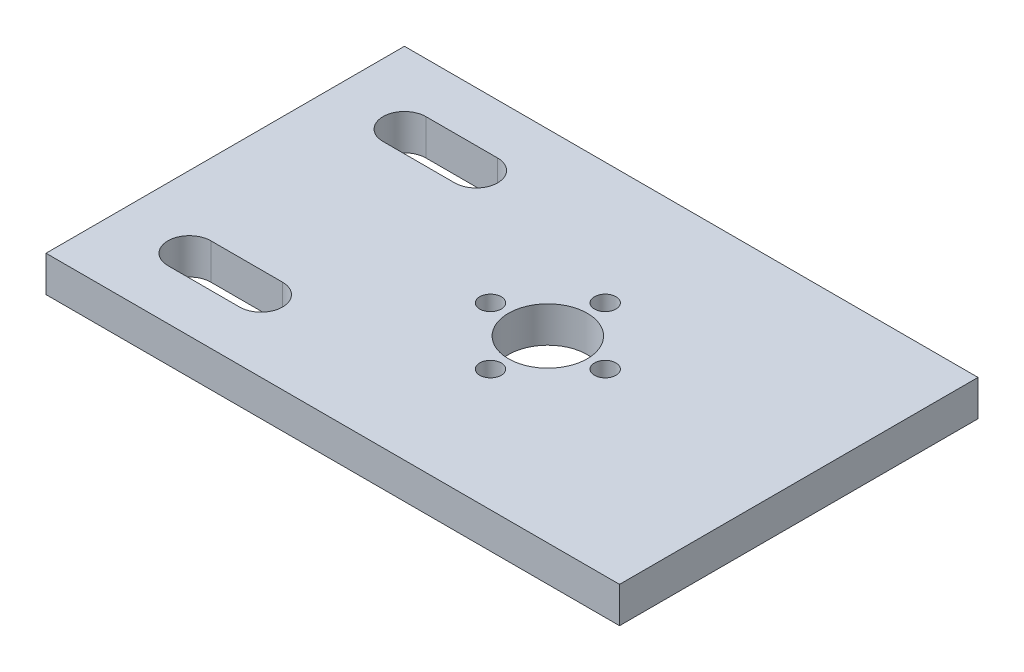
ISO-10303-21;
HEADER;
FILE_DESCRIPTION(('STEP AP214'),'2;1');
FILE_NAME('part.step','',(''),(''),'','','');
FILE_SCHEMA(('AUTOMOTIVE_DESIGN { 1 0 10303 214 1 1 1 1 }'));
ENDSEC;
DATA;
#1=APPLICATION_CONTEXT('core data for automotive mechanical design processes');
#2=APPLICATION_PROTOCOL_DEFINITION('international standard','automotive_design',2000,#1);
#3=PRODUCT_CONTEXT('',#1,'mechanical');
#4=PRODUCT('Part','Part','',(#3));
#5=PRODUCT_RELATED_PRODUCT_CATEGORY('part','',(#4));
#6=PRODUCT_DEFINITION_FORMATION('','',#4);
#7=PRODUCT_DEFINITION_CONTEXT('part definition',#1,'design');
#8=PRODUCT_DEFINITION('design','',#6,#7);
#9=PRODUCT_DEFINITION_SHAPE('','',#8);
#10=(LENGTH_UNIT() NAMED_UNIT(*) SI_UNIT(.MILLI.,.METRE.));
#11=(NAMED_UNIT(*) PLANE_ANGLE_UNIT() SI_UNIT($,.RADIAN.));
#12=(NAMED_UNIT(*) SI_UNIT($,.STERADIAN.) SOLID_ANGLE_UNIT());
#13=UNCERTAINTY_MEASURE_WITH_UNIT(LENGTH_MEASURE(1.E-05),#10,'distance_accuracy_value','');
#14=(GEOMETRIC_REPRESENTATION_CONTEXT(3) GLOBAL_UNCERTAINTY_ASSIGNED_CONTEXT((#13)) GLOBAL_UNIT_ASSIGNED_CONTEXT((#10,
#11,#12)) REPRESENTATION_CONTEXT('',''));
#15=CARTESIAN_POINT('',(0.,0.,0.));
#16=DIRECTION('',(0.,0.,1.));
#17=DIRECTION('',(1.,0.,0.));
#18=AXIS2_PLACEMENT_3D('',#15,#16,#17);
#19=CARTESIAN_POINT('',(0.,5.,0.));
#20=DIRECTION('',(0.,-1.,0.));
#21=DIRECTION('',(0.,0.,-1.));
#22=AXIS2_PLACEMENT_3D('',#19,#20,#21);
#23=PLANE('',#22);
#24=CARTESIAN_POINT('',(53.,5.,-25.));
#25=DIRECTION('',(0.,-1.,0.));
#26=DIRECTION('',(0.,0.,-1.));
#27=AXIS2_PLACEMENT_3D('',#24,#25,#26);
#28=CIRCLE('',#27,1.5);
#29=CARTESIAN_POINT('',(53.,5.,-26.5));
#30=VERTEX_POINT('',#29);
#31=EDGE_CURVE('E322',#30,#30,#28,.T.);
#32=ORIENTED_EDGE('',*,*,#31,.T.);
#33=EDGE_LOOP('',(#32));
#34=FACE_BOUND('',#33,.T.);
#35=CARTESIAN_POINT('',(45.,5.,-33.));
#36=DIRECTION('',(0.,-1.,0.));
#37=DIRECTION('',(0.,0.,-1.));
#38=AXIS2_PLACEMENT_3D('',#35,#36,#37);
#39=CIRCLE('',#38,1.5);
#40=CARTESIAN_POINT('',(45.,5.,-34.5));
#41=VERTEX_POINT('',#40);
#42=EDGE_CURVE('E326',#41,#41,#39,.T.);
#43=ORIENTED_EDGE('',*,*,#42,.T.);
#44=EDGE_LOOP('',(#43));
#45=FACE_BOUND('',#44,.T.);
#46=CARTESIAN_POINT('',(37.,5.,-25.));
#47=DIRECTION('',(0.,-1.,0.));
#48=DIRECTION('',(0.,0.,-1.));
#49=AXIS2_PLACEMENT_3D('',#46,#47,#48);
#50=CIRCLE('',#49,1.5);
#51=CARTESIAN_POINT('',(37.,5.,-26.5));
#52=VERTEX_POINT('',#51);
#53=EDGE_CURVE('E336',#52,#52,#50,.T.);
#54=ORIENTED_EDGE('',*,*,#53,.T.);
#55=EDGE_LOOP('',(#54));
#56=FACE_BOUND('',#55,.T.);
#57=CARTESIAN_POINT('',(45.,5.,-17.));
#58=DIRECTION('',(0.,-1.,0.));
#59=DIRECTION('',(0.,0.,-1.));
#60=AXIS2_PLACEMENT_3D('',#57,#58,#59);
#61=CIRCLE('',#60,1.5);
#62=CARTESIAN_POINT('',(45.,5.,-18.5));
#63=VERTEX_POINT('',#62);
#64=EDGE_CURVE('E342',#63,#63,#61,.T.);
#65=ORIENTED_EDGE('',*,*,#64,.T.);
#66=EDGE_LOOP('',(#65));
#67=FACE_BOUND('',#66,.T.);
#68=CARTESIAN_POINT('',(10.,5.,-40.));
#69=DIRECTION('',(0.,1.,0.));
#70=DIRECTION('',(0.,0.,1.));
#71=AXIS2_PLACEMENT_3D('',#68,#69,#70);
#72=CIRCLE('',#71,3.00000000000001);
#73=CARTESIAN_POINT('',(10.,5.,-43.));
#74=VERTEX_POINT('',#73);
#75=CARTESIAN_POINT('',(10.,5.,-37.));
#76=VERTEX_POINT('',#75);
#77=EDGE_CURVE('E161',#74,#76,#72,.T.);
#78=ORIENTED_EDGE('',*,*,#77,.F.);
#79=DIRECTION('',(-1.,0.,0.));
#80=VECTOR('',#79,1.);
#81=CARTESIAN_POINT('',(10.,5.,-43.));
#82=LINE('',#81,#80);
#83=CARTESIAN_POINT('',(20.,5.,-43.));
#84=VERTEX_POINT('',#83);
#85=EDGE_CURVE('E169',#84,#74,#82,.T.);
#86=ORIENTED_EDGE('',*,*,#85,.F.);
#87=CARTESIAN_POINT('',(20.,5.,-40.));
#88=DIRECTION('',(0.,1.,0.));
#89=DIRECTION('',(0.,0.,1.));
#90=AXIS2_PLACEMENT_3D('',#87,#88,#89);
#91=CIRCLE('',#90,3.00000000000001);
#92=CARTESIAN_POINT('',(20.,5.,-37.));
#93=VERTEX_POINT('',#92);
#94=EDGE_CURVE('E166',#93,#84,#91,.T.);
#95=ORIENTED_EDGE('',*,*,#94,.F.);
#96=DIRECTION('',(1.,0.,0.));
#97=VECTOR('',#96,1.);
#98=CARTESIAN_POINT('',(10.,5.,-37.));
#99=LINE('',#98,#97);
#100=EDGE_CURVE('E163',#76,#93,#99,.T.);
#101=ORIENTED_EDGE('',*,*,#100,.F.);
#102=EDGE_LOOP('',(#78,#86,#95,#101));
#103=FACE_BOUND('',#102,.T.);
#104=DIRECTION('',(0.,0.,1.));
#105=VECTOR('',#104,1.);
#106=CARTESIAN_POINT('',(0.,5.,0.));
#107=LINE('',#106,#105);
#108=CARTESIAN_POINT('',(0.,5.,-50.));
#109=VERTEX_POINT('',#108);
#110=CARTESIAN_POINT('',(0.,5.,0.));
#111=VERTEX_POINT('',#110);
#112=EDGE_CURVE('E192',#109,#111,#107,.T.);
#113=ORIENTED_EDGE('',*,*,#112,.T.);
#114=DIRECTION('',(1.,0.,0.));
#115=VECTOR('',#114,1.);
#116=CARTESIAN_POINT('',(0.,5.,0.));
#117=LINE('',#116,#115);
#118=CARTESIAN_POINT('',(80.,5.,0.));
#119=VERTEX_POINT('',#118);
#120=EDGE_CURVE('E195',#111,#119,#117,.T.);
#121=ORIENTED_EDGE('',*,*,#120,.T.);
#122=DIRECTION('',(0.,0.,-1.));
#123=VECTOR('',#122,1.);
#124=CARTESIAN_POINT('',(80.,5.,0.));
#125=LINE('',#124,#123);
#126=CARTESIAN_POINT('',(80.,5.,-50.));
#127=VERTEX_POINT('',#126);
#128=EDGE_CURVE('E198',#119,#127,#125,.T.);
#129=ORIENTED_EDGE('',*,*,#128,.T.);
#130=DIRECTION('',(-1.,0.,0.));
#131=VECTOR('',#130,1.);
#132=CARTESIAN_POINT('',(0.,5.,-50.));
#133=LINE('',#132,#131);
#134=EDGE_CURVE('E200',#127,#109,#133,.T.);
#135=ORIENTED_EDGE('',*,*,#134,.T.);
#136=EDGE_LOOP('',(#113,#121,#129,#135));
#137=FACE_BOUND('',#136,.T.);
#138=CARTESIAN_POINT('',(10.,5.,-10.));
#139=DIRECTION('',(0.,1.,0.));
#140=DIRECTION('',(0.,0.,1.));
#141=AXIS2_PLACEMENT_3D('',#138,#139,#140);
#142=CIRCLE('',#141,3.);
#143=CARTESIAN_POINT('',(10.,5.,-13.));
#144=VERTEX_POINT('',#143);
#145=CARTESIAN_POINT('',(10.,5.,-7.));
#146=VERTEX_POINT('',#145);
#147=EDGE_CURVE('E122',#144,#146,#142,.T.);
#148=ORIENTED_EDGE('',*,*,#147,.F.);
#149=DIRECTION('',(-1.,0.,0.));
#150=VECTOR('',#149,1.);
#151=CARTESIAN_POINT('',(10.,5.,-13.));
#152=LINE('',#151,#150);
#153=CARTESIAN_POINT('',(20.,5.,-13.));
#154=VERTEX_POINT('',#153);
#155=EDGE_CURVE('E145',#154,#144,#152,.T.);
#156=ORIENTED_EDGE('',*,*,#155,.F.);
#157=CARTESIAN_POINT('',(20.,5.,-10.));
#158=DIRECTION('',(0.,1.,0.));
#159=DIRECTION('',(0.,0.,1.));
#160=AXIS2_PLACEMENT_3D('',#157,#158,#159);
#161=CIRCLE('',#160,3.);
#162=CARTESIAN_POINT('',(20.,5.,-7.));
#163=VERTEX_POINT('',#162);
#164=EDGE_CURVE('E143',#163,#154,#161,.T.);
#165=ORIENTED_EDGE('',*,*,#164,.F.);
#166=DIRECTION('',(1.,0.,0.));
#167=VECTOR('',#166,1.);
#168=CARTESIAN_POINT('',(10.,5.,-7.));
#169=LINE('',#168,#167);
#170=EDGE_CURVE('E130',#146,#163,#169,.T.);
#171=ORIENTED_EDGE('',*,*,#170,.F.);
#172=EDGE_LOOP('',(#148,#156,#165,#171));
#173=FACE_BOUND('',#172,.T.);
#174=CARTESIAN_POINT('',(45.,5.,-25.));
#175=DIRECTION('',(0.,1.,0.));
#176=DIRECTION('',(0.,0.,1.));
#177=AXIS2_PLACEMENT_3D('',#174,#175,#176);
#178=CIRCLE('',#177,5.5);
#179=CARTESIAN_POINT('',(45.,5.,-19.5));
#180=VERTEX_POINT('',#179);
#181=EDGE_CURVE('E151',#180,#180,#178,.T.);
#182=ORIENTED_EDGE('',*,*,#181,.F.);
#183=EDGE_LOOP('',(#182));
#184=FACE_BOUND('',#183,.T.);
#185=ADVANCED_FACE('F33',(#34,#45,#56,#67,#103,#137,#173,#184),#23,.F.);
#186=CARTESIAN_POINT('',(0.,0.,0.));
#187=DIRECTION('',(0.,-1.,0.));
#188=DIRECTION('',(0.,0.,-1.));
#189=AXIS2_PLACEMENT_3D('',#186,#187,#188);
#190=PLANE('',#189);
#191=CARTESIAN_POINT('',(53.,0.,-25.));
#192=DIRECTION('',(0.,-1.,0.));
#193=DIRECTION('',(0.,0.,-1.));
#194=AXIS2_PLACEMENT_3D('',#191,#192,#193);
#195=CIRCLE('',#194,1.5);
#196=CARTESIAN_POINT('',(53.,0.,-26.5));
#197=VERTEX_POINT('',#196);
#198=EDGE_CURVE('E325',#197,#197,#195,.T.);
#199=ORIENTED_EDGE('',*,*,#198,.F.);
#200=EDGE_LOOP('',(#199));
#201=FACE_BOUND('',#200,.T.);
#202=CARTESIAN_POINT('',(45.,0.,-33.));
#203=DIRECTION('',(0.,-1.,0.));
#204=DIRECTION('',(0.,0.,-1.));
#205=AXIS2_PLACEMENT_3D('',#202,#203,#204);
#206=CIRCLE('',#205,1.5);
#207=CARTESIAN_POINT('',(45.,0.,-34.5));
#208=VERTEX_POINT('',#207);
#209=EDGE_CURVE('E331',#208,#208,#206,.T.);
#210=ORIENTED_EDGE('',*,*,#209,.F.);
#211=EDGE_LOOP('',(#210));
#212=FACE_BOUND('',#211,.T.);
#213=CARTESIAN_POINT('',(37.,0.,-25.));
#214=DIRECTION('',(0.,-1.,0.));
#215=DIRECTION('',(0.,0.,-1.));
#216=AXIS2_PLACEMENT_3D('',#213,#214,#215);
#217=CIRCLE('',#216,1.5);
#218=CARTESIAN_POINT('',(37.,0.,-26.5));
#219=VERTEX_POINT('',#218);
#220=EDGE_CURVE('E339',#219,#219,#217,.T.);
#221=ORIENTED_EDGE('',*,*,#220,.F.);
#222=EDGE_LOOP('',(#221));
#223=FACE_BOUND('',#222,.T.);
#224=CARTESIAN_POINT('',(45.,0.,-17.));
#225=DIRECTION('',(0.,-1.,0.));
#226=DIRECTION('',(0.,0.,-1.));
#227=AXIS2_PLACEMENT_3D('',#224,#225,#226);
#228=CIRCLE('',#227,1.5);
#229=CARTESIAN_POINT('',(45.,0.,-18.5));
#230=VERTEX_POINT('',#229);
#231=EDGE_CURVE('E328',#230,#230,#228,.T.);
#232=ORIENTED_EDGE('',*,*,#231,.F.);
#233=EDGE_LOOP('',(#232));
#234=FACE_BOUND('',#233,.T.);
#235=DIRECTION('',(-1.,0.,0.));
#236=VECTOR('',#235,1.);
#237=CARTESIAN_POINT('',(10.,0.,-13.));
#238=LINE('',#237,#236);
#239=CARTESIAN_POINT('',(20.,0.,-13.));
#240=VERTEX_POINT('',#239);
#241=CARTESIAN_POINT('',(10.,0.,-13.));
#242=VERTEX_POINT('',#241);
#243=EDGE_CURVE('E131',#240,#242,#238,.T.);
#244=ORIENTED_EDGE('',*,*,#243,.T.);
#245=CARTESIAN_POINT('',(10.,0.,-10.));
#246=DIRECTION('',(0.,1.,0.));
#247=DIRECTION('',(0.,0.,1.));
#248=AXIS2_PLACEMENT_3D('',#245,#246,#247);
#249=CIRCLE('',#248,3.);
#250=CARTESIAN_POINT('',(10.,0.,-7.));
#251=VERTEX_POINT('',#250);
#252=EDGE_CURVE('E56',#242,#251,#249,.T.);
#253=ORIENTED_EDGE('',*,*,#252,.T.);
#254=DIRECTION('',(1.,0.,0.));
#255=VECTOR('',#254,1.);
#256=CARTESIAN_POINT('',(10.,0.,-7.));
#257=LINE('',#256,#255);
#258=CARTESIAN_POINT('',(20.,0.,-7.));
#259=VERTEX_POINT('',#258);
#260=EDGE_CURVE('E137',#251,#259,#257,.T.);
#261=ORIENTED_EDGE('',*,*,#260,.T.);
#262=CARTESIAN_POINT('',(20.,0.,-10.));
#263=DIRECTION('',(0.,1.,0.));
#264=DIRECTION('',(0.,0.,1.));
#265=AXIS2_PLACEMENT_3D('',#262,#263,#264);
#266=CIRCLE('',#265,3.);
#267=EDGE_CURVE('E153',#259,#240,#266,.T.);
#268=ORIENTED_EDGE('',*,*,#267,.T.);
#269=EDGE_LOOP('',(#244,#253,#261,#268));
#270=FACE_BOUND('',#269,.T.);
#271=DIRECTION('',(-1.,0.,0.));
#272=VECTOR('',#271,1.);
#273=CARTESIAN_POINT('',(10.,0.,-43.));
#274=LINE('',#273,#272);
#275=CARTESIAN_POINT('',(20.,0.,-43.));
#276=VERTEX_POINT('',#275);
#277=CARTESIAN_POINT('',(10.,0.,-43.));
#278=VERTEX_POINT('',#277);
#279=EDGE_CURVE('E164',#276,#278,#274,.T.);
#280=ORIENTED_EDGE('',*,*,#279,.T.);
#281=CARTESIAN_POINT('',(10.,0.,-40.));
#282=DIRECTION('',(0.,1.,0.));
#283=DIRECTION('',(0.,0.,1.));
#284=AXIS2_PLACEMENT_3D('',#281,#282,#283);
#285=CIRCLE('',#284,3.00000000000001);
#286=CARTESIAN_POINT('',(10.,0.,-37.));
#287=VERTEX_POINT('',#286);
#288=EDGE_CURVE('E138',#278,#287,#285,.T.);
#289=ORIENTED_EDGE('',*,*,#288,.T.);
#290=DIRECTION('',(1.,0.,0.));
#291=VECTOR('',#290,1.);
#292=CARTESIAN_POINT('',(10.,0.,-37.));
#293=LINE('',#292,#291);
#294=CARTESIAN_POINT('',(20.,0.,-37.));
#295=VERTEX_POINT('',#294);
#296=EDGE_CURVE('E174',#287,#295,#293,.T.);
#297=ORIENTED_EDGE('',*,*,#296,.T.);
#298=CARTESIAN_POINT('',(20.,0.,-40.));
#299=DIRECTION('',(0.,1.,0.));
#300=DIRECTION('',(0.,0.,1.));
#301=AXIS2_PLACEMENT_3D('',#298,#299,#300);
#302=CIRCLE('',#301,3.00000000000001);
#303=EDGE_CURVE('E177',#295,#276,#302,.T.);
#304=ORIENTED_EDGE('',*,*,#303,.T.);
#305=EDGE_LOOP('',(#280,#289,#297,#304));
#306=FACE_BOUND('',#305,.T.);
#307=DIRECTION('',(0.,0.,1.));
#308=VECTOR('',#307,1.);
#309=CARTESIAN_POINT('',(0.,0.,0.));
#310=LINE('',#309,#308);
#311=CARTESIAN_POINT('',(0.,0.,-50.));
#312=VERTEX_POINT('',#311);
#313=CARTESIAN_POINT('',(0.,0.,0.));
#314=VERTEX_POINT('',#313);
#315=EDGE_CURVE('E191',#312,#314,#310,.T.);
#316=ORIENTED_EDGE('',*,*,#315,.F.);
#317=DIRECTION('',(-1.,0.,0.));
#318=VECTOR('',#317,1.);
#319=CARTESIAN_POINT('',(0.,0.,-50.));
#320=LINE('',#319,#318);
#321=CARTESIAN_POINT('',(80.,0.,-50.));
#322=VERTEX_POINT('',#321);
#323=EDGE_CURVE('E196',#322,#312,#320,.T.);
#324=ORIENTED_EDGE('',*,*,#323,.F.);
#325=DIRECTION('',(0.,0.,-1.));
#326=VECTOR('',#325,1.);
#327=CARTESIAN_POINT('',(80.,0.,0.));
#328=LINE('',#327,#326);
#329=CARTESIAN_POINT('',(80.,0.,0.));
#330=VERTEX_POINT('',#329);
#331=EDGE_CURVE('E207',#330,#322,#328,.T.);
#332=ORIENTED_EDGE('',*,*,#331,.F.);
#333=DIRECTION('',(1.,0.,0.));
#334=VECTOR('',#333,1.);
#335=CARTESIAN_POINT('',(0.,0.,0.));
#336=LINE('',#335,#334);
#337=EDGE_CURVE('E205',#314,#330,#336,.T.);
#338=ORIENTED_EDGE('',*,*,#337,.F.);
#339=EDGE_LOOP('',(#316,#324,#332,#338));
#340=FACE_BOUND('',#339,.T.);
#341=CARTESIAN_POINT('',(45.,0.,-25.));
#342=DIRECTION('',(0.,1.,0.));
#343=DIRECTION('',(0.,0.,1.));
#344=AXIS2_PLACEMENT_3D('',#341,#342,#343);
#345=CIRCLE('',#344,5.5);
#346=CARTESIAN_POINT('',(45.,0.,-19.5));
#347=VERTEX_POINT('',#346);
#348=EDGE_CURVE('E345',#347,#347,#345,.T.);
#349=ORIENTED_EDGE('',*,*,#348,.T.);
#350=EDGE_LOOP('',(#349));
#351=FACE_BOUND('',#350,.T.);
#352=ADVANCED_FACE('F225',(#201,#212,#223,#234,#270,#306,#340,#351),#190,.T.);
#353=CARTESIAN_POINT('',(0.,5.,0.));
#354=DIRECTION('',(1.,0.,0.));
#355=DIRECTION('',(0.,0.,-1.));
#356=AXIS2_PLACEMENT_3D('',#353,#354,#355);
#357=PLANE('',#356);
#358=ORIENTED_EDGE('',*,*,#315,.T.);
#359=DIRECTION('',(0.,-1.,0.));
#360=VECTOR('',#359,1.);
#361=CARTESIAN_POINT('',(0.,5.,0.));
#362=LINE('',#361,#360);
#363=EDGE_CURVE('E11',#111,#314,#362,.T.);
#364=ORIENTED_EDGE('',*,*,#363,.F.);
#365=ORIENTED_EDGE('',*,*,#112,.F.);
#366=DIRECTION('',(0.,-1.,0.));
#367=VECTOR('',#366,1.);
#368=CARTESIAN_POINT('',(0.,5.,-50.));
#369=LINE('',#368,#367);
#370=EDGE_CURVE('E202',#109,#312,#369,.T.);
#371=ORIENTED_EDGE('',*,*,#370,.T.);
#372=EDGE_LOOP('',(#358,#364,#365,#371));
#373=FACE_BOUND('',#372,.T.);
#374=ADVANCED_FACE('F35',(#373),#357,.F.);
#375=CARTESIAN_POINT('',(0.,5.,0.));
#376=DIRECTION('',(0.,0.,-1.));
#377=DIRECTION('',(-1.,0.,0.));
#378=AXIS2_PLACEMENT_3D('',#375,#376,#377);
#379=PLANE('',#378);
#380=ORIENTED_EDGE('',*,*,#337,.T.);
#381=DIRECTION('',(0.,-1.,0.));
#382=VECTOR('',#381,1.);
#383=CARTESIAN_POINT('',(80.,5.,0.));
#384=LINE('',#383,#382);
#385=EDGE_CURVE('E41',#119,#330,#384,.T.);
#386=ORIENTED_EDGE('',*,*,#385,.F.);
#387=ORIENTED_EDGE('',*,*,#120,.F.);
#388=ORIENTED_EDGE('',*,*,#363,.T.);
#389=EDGE_LOOP('',(#380,#386,#387,#388));
#390=FACE_BOUND('',#389,.T.);
#391=ADVANCED_FACE('F235',(#390),#379,.F.);
#392=CARTESIAN_POINT('',(80.,5.,0.));
#393=DIRECTION('',(-1.,0.,0.));
#394=DIRECTION('',(0.,0.,1.));
#395=AXIS2_PLACEMENT_3D('',#392,#393,#394);
#396=PLANE('',#395);
#397=ORIENTED_EDGE('',*,*,#331,.T.);
#398=DIRECTION('',(0.,-1.,0.));
#399=VECTOR('',#398,1.);
#400=CARTESIAN_POINT('',(80.,5.,-50.));
#401=LINE('',#400,#399);
#402=EDGE_CURVE('E212',#127,#322,#401,.T.);
#403=ORIENTED_EDGE('',*,*,#402,.F.);
#404=ORIENTED_EDGE('',*,*,#128,.F.);
#405=ORIENTED_EDGE('',*,*,#385,.T.);
#406=EDGE_LOOP('',(#397,#403,#404,#405));
#407=FACE_BOUND('',#406,.T.);
#408=ADVANCED_FACE('F219',(#407),#396,.F.);
#409=CARTESIAN_POINT('',(0.,5.,-50.));
#410=DIRECTION('',(0.,0.,1.));
#411=DIRECTION('',(1.,0.,0.));
#412=AXIS2_PLACEMENT_3D('',#409,#410,#411);
#413=PLANE('',#412);
#414=ORIENTED_EDGE('',*,*,#323,.T.);
#415=ORIENTED_EDGE('',*,*,#370,.F.);
#416=ORIENTED_EDGE('',*,*,#134,.F.);
#417=ORIENTED_EDGE('',*,*,#402,.T.);
#418=EDGE_LOOP('',(#414,#415,#416,#417));
#419=FACE_BOUND('',#418,.T.);
#420=ADVANCED_FACE('F229',(#419),#413,.F.);
#421=CARTESIAN_POINT('',(10.,5.,-40.));
#422=DIRECTION('',(0.,-1.,0.));
#423=DIRECTION('',(0.,0.,-1.));
#424=AXIS2_PLACEMENT_3D('',#421,#422,#423);
#425=CYLINDRICAL_SURFACE('',#424,3.00000000000001);
#426=ORIENTED_EDGE('',*,*,#288,.F.);
#427=DIRECTION('',(0.,-1.,0.));
#428=VECTOR('',#427,1.);
#429=CARTESIAN_POINT('',(10.,5.,-43.));
#430=LINE('',#429,#428);
#431=EDGE_CURVE('E171',#74,#278,#430,.T.);
#432=ORIENTED_EDGE('',*,*,#431,.F.);
#433=ORIENTED_EDGE('',*,*,#77,.T.);
#434=DIRECTION('',(0.,-1.,0.));
#435=VECTOR('',#434,1.);
#436=CARTESIAN_POINT('',(10.,5.,-37.));
#437=LINE('',#436,#435);
#438=EDGE_CURVE('E188',#76,#287,#437,.T.);
#439=ORIENTED_EDGE('',*,*,#438,.T.);
#440=EDGE_LOOP('',(#426,#432,#433,#439));
#441=FACE_BOUND('',#440,.T.);
#442=ADVANCED_FACE('F253',(#441),#425,.F.);
#443=CARTESIAN_POINT('',(10.,5.,-37.));
#444=DIRECTION('',(0.,0.,-1.));
#445=DIRECTION('',(-1.,0.,0.));
#446=AXIS2_PLACEMENT_3D('',#443,#444,#445);
#447=PLANE('',#446);
#448=ORIENTED_EDGE('',*,*,#296,.F.);
#449=ORIENTED_EDGE('',*,*,#438,.F.);
#450=ORIENTED_EDGE('',*,*,#100,.T.);
#451=DIRECTION('',(0.,-1.,0.));
#452=VECTOR('',#451,1.);
#453=CARTESIAN_POINT('',(20.,5.,-37.));
#454=LINE('',#453,#452);
#455=EDGE_CURVE('E186',#93,#295,#454,.T.);
#456=ORIENTED_EDGE('',*,*,#455,.T.);
#457=EDGE_LOOP('',(#448,#449,#450,#456));
#458=FACE_BOUND('',#457,.T.);
#459=ADVANCED_FACE('F260',(#458),#447,.T.);
#460=CARTESIAN_POINT('',(20.,5.,-40.));
#461=DIRECTION('',(0.,-1.,0.));
#462=DIRECTION('',(0.,0.,-1.));
#463=AXIS2_PLACEMENT_3D('',#460,#461,#462);
#464=CYLINDRICAL_SURFACE('',#463,3.00000000000001);
#465=ORIENTED_EDGE('',*,*,#303,.F.);
#466=ORIENTED_EDGE('',*,*,#455,.F.);
#467=ORIENTED_EDGE('',*,*,#94,.T.);
#468=DIRECTION('',(0.,-1.,0.));
#469=VECTOR('',#468,1.);
#470=CARTESIAN_POINT('',(20.,5.,-43.));
#471=LINE('',#470,#469);
#472=EDGE_CURVE('E184',#84,#276,#471,.T.);
#473=ORIENTED_EDGE('',*,*,#472,.T.);
#474=EDGE_LOOP('',(#465,#466,#467,#473));
#475=FACE_BOUND('',#474,.T.);
#476=ADVANCED_FACE('F265',(#475),#464,.F.);
#477=CARTESIAN_POINT('',(10.,5.,-43.));
#478=DIRECTION('',(0.,0.,1.));
#479=DIRECTION('',(1.,0.,0.));
#480=AXIS2_PLACEMENT_3D('',#477,#478,#479);
#481=PLANE('',#480);
#482=ORIENTED_EDGE('',*,*,#279,.F.);
#483=ORIENTED_EDGE('',*,*,#472,.F.);
#484=ORIENTED_EDGE('',*,*,#85,.T.);
#485=ORIENTED_EDGE('',*,*,#431,.T.);
#486=EDGE_LOOP('',(#482,#483,#484,#485));
#487=FACE_BOUND('',#486,.T.);
#488=ADVANCED_FACE('F273',(#487),#481,.T.);
#489=CARTESIAN_POINT('',(10.,5.,-10.));
#490=DIRECTION('',(0.,-1.,0.));
#491=DIRECTION('',(0.,0.,-1.));
#492=AXIS2_PLACEMENT_3D('',#489,#490,#491);
#493=CYLINDRICAL_SURFACE('',#492,3.);
#494=ORIENTED_EDGE('',*,*,#252,.F.);
#495=DIRECTION('',(0.,-1.,0.));
#496=VECTOR('',#495,1.);
#497=CARTESIAN_POINT('',(10.,5.,-13.));
#498=LINE('',#497,#496);
#499=EDGE_CURVE('E126',#144,#242,#498,.T.);
#500=ORIENTED_EDGE('',*,*,#499,.F.);
#501=ORIENTED_EDGE('',*,*,#147,.T.);
#502=DIRECTION('',(0.,-1.,0.));
#503=VECTOR('',#502,1.);
#504=CARTESIAN_POINT('',(10.,5.,-7.));
#505=LINE('',#504,#503);
#506=EDGE_CURVE('E125',#146,#251,#505,.T.);
#507=ORIENTED_EDGE('',*,*,#506,.T.);
#508=EDGE_LOOP('',(#494,#500,#501,#507));
#509=FACE_BOUND('',#508,.T.);
#510=ADVANCED_FACE('F124',(#509),#493,.F.);
#511=CARTESIAN_POINT('',(10.,5.,-7.));
#512=DIRECTION('',(0.,0.,-1.));
#513=DIRECTION('',(-1.,0.,0.));
#514=AXIS2_PLACEMENT_3D('',#511,#512,#513);
#515=PLANE('',#514);
#516=ORIENTED_EDGE('',*,*,#260,.F.);
#517=ORIENTED_EDGE('',*,*,#506,.F.);
#518=ORIENTED_EDGE('',*,*,#170,.T.);
#519=DIRECTION('',(0.,-1.,0.));
#520=VECTOR('',#519,1.);
#521=CARTESIAN_POINT('',(20.,5.,-7.));
#522=LINE('',#521,#520);
#523=EDGE_CURVE('E139',#163,#259,#522,.T.);
#524=ORIENTED_EDGE('',*,*,#523,.T.);
#525=EDGE_LOOP('',(#516,#517,#518,#524));
#526=FACE_BOUND('',#525,.T.);
#527=ADVANCED_FACE('F134',(#526),#515,.T.);
#528=CARTESIAN_POINT('',(20.,5.,-10.));
#529=DIRECTION('',(0.,-1.,0.));
#530=DIRECTION('',(0.,0.,-1.));
#531=AXIS2_PLACEMENT_3D('',#528,#529,#530);
#532=CYLINDRICAL_SURFACE('',#531,3.);
#533=ORIENTED_EDGE('',*,*,#267,.F.);
#534=ORIENTED_EDGE('',*,*,#523,.F.);
#535=ORIENTED_EDGE('',*,*,#164,.T.);
#536=DIRECTION('',(0.,-1.,0.));
#537=VECTOR('',#536,1.);
#538=CARTESIAN_POINT('',(20.,5.,-13.));
#539=LINE('',#538,#537);
#540=EDGE_CURVE('E48',#154,#240,#539,.T.);
#541=ORIENTED_EDGE('',*,*,#540,.T.);
#542=EDGE_LOOP('',(#533,#534,#535,#541));
#543=FACE_BOUND('',#542,.T.);
#544=ADVANCED_FACE('F292',(#543),#532,.F.);
#545=CARTESIAN_POINT('',(10.,5.,-13.));
#546=DIRECTION('',(0.,0.,1.));
#547=DIRECTION('',(1.,0.,0.));
#548=AXIS2_PLACEMENT_3D('',#545,#546,#547);
#549=PLANE('',#548);
#550=ORIENTED_EDGE('',*,*,#243,.F.);
#551=ORIENTED_EDGE('',*,*,#540,.F.);
#552=ORIENTED_EDGE('',*,*,#155,.T.);
#553=ORIENTED_EDGE('',*,*,#499,.T.);
#554=EDGE_LOOP('',(#550,#551,#552,#553));
#555=FACE_BOUND('',#554,.T.);
#556=ADVANCED_FACE('F295',(#555),#549,.T.);
#557=CARTESIAN_POINT('',(45.,5.,-25.));
#558=DIRECTION('',(0.,-1.,0.));
#559=DIRECTION('',(0.,0.,-1.));
#560=AXIS2_PLACEMENT_3D('',#557,#558,#559);
#561=CYLINDRICAL_SURFACE('',#560,5.5);
#562=ORIENTED_EDGE('',*,*,#181,.T.);
#563=EDGE_LOOP('',(#562));
#564=FACE_BOUND('',#563,.T.);
#565=ORIENTED_EDGE('',*,*,#348,.F.);
#566=EDGE_LOOP('',(#565));
#567=FACE_BOUND('',#566,.T.);
#568=ADVANCED_FACE('F299',(#564,#567),#561,.F.);
#569=CARTESIAN_POINT('',(45.,5.,-17.));
#570=DIRECTION('',(0.,-1.,0.));
#571=DIRECTION('',(0.,0.,-1.));
#572=AXIS2_PLACEMENT_3D('',#569,#570,#571);
#573=CYLINDRICAL_SURFACE('',#572,1.5);
#574=ORIENTED_EDGE('',*,*,#64,.F.);
#575=EDGE_LOOP('',(#574));
#576=FACE_BOUND('',#575,.T.);
#577=ORIENTED_EDGE('',*,*,#231,.T.);
#578=EDGE_LOOP('',(#577));
#579=FACE_BOUND('',#578,.T.);
#580=ADVANCED_FACE('F302',(#576,#579),#573,.F.);
#581=CARTESIAN_POINT('',(37.,5.,-25.));
#582=DIRECTION('',(0.,-1.,0.));
#583=DIRECTION('',(0.,0.,-1.));
#584=AXIS2_PLACEMENT_3D('',#581,#582,#583);
#585=CYLINDRICAL_SURFACE('',#584,1.5);
#586=ORIENTED_EDGE('',*,*,#53,.F.);
#587=EDGE_LOOP('',(#586));
#588=FACE_BOUND('',#587,.T.);
#589=ORIENTED_EDGE('',*,*,#220,.T.);
#590=EDGE_LOOP('',(#589));
#591=FACE_BOUND('',#590,.T.);
#592=ADVANCED_FACE('F306',(#588,#591),#585,.F.);
#593=CARTESIAN_POINT('',(45.,5.,-33.));
#594=DIRECTION('',(0.,-1.,0.));
#595=DIRECTION('',(0.,0.,-1.));
#596=AXIS2_PLACEMENT_3D('',#593,#594,#595);
#597=CYLINDRICAL_SURFACE('',#596,1.5);
#598=ORIENTED_EDGE('',*,*,#42,.F.);
#599=EDGE_LOOP('',(#598));
#600=FACE_BOUND('',#599,.T.);
#601=ORIENTED_EDGE('',*,*,#209,.T.);
#602=EDGE_LOOP('',(#601));
#603=FACE_BOUND('',#602,.T.);
#604=ADVANCED_FACE('F310',(#600,#603),#597,.F.);
#605=CARTESIAN_POINT('',(53.,5.,-25.));
#606=DIRECTION('',(0.,-1.,0.));
#607=DIRECTION('',(0.,0.,-1.));
#608=AXIS2_PLACEMENT_3D('',#605,#606,#607);
#609=CYLINDRICAL_SURFACE('',#608,1.5);
#610=ORIENTED_EDGE('',*,*,#31,.F.);
#611=EDGE_LOOP('',(#610));
#612=FACE_BOUND('',#611,.T.);
#613=ORIENTED_EDGE('',*,*,#198,.T.);
#614=EDGE_LOOP('',(#613));
#615=FACE_BOUND('',#614,.T.);
#616=ADVANCED_FACE('F314',(#612,#615),#609,.F.);
#617=CLOSED_SHELL('',(#185,#352,#374,#391,#408,#420,#442,#459,#476,#488,#510,#527,#544,#556,
#568,#580,#592,#604,#616));
#618=MANIFOLD_SOLID_BREP('B2',#617);
#619=ADVANCED_BREP_SHAPE_REPRESENTATION('',(#18,#618),#14);
#620=SHAPE_DEFINITION_REPRESENTATION(#9,#619);
ENDSEC;
END-ISO-10303-21;
